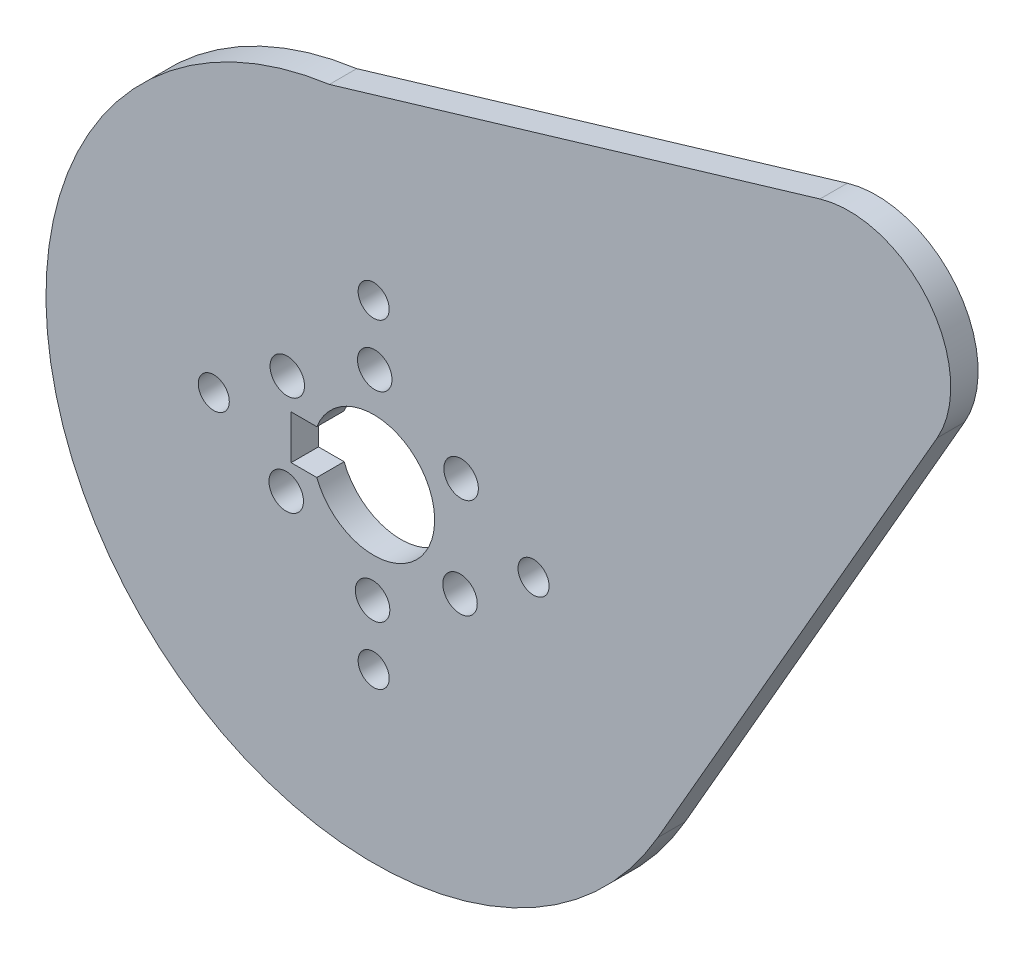
ISO-10303-21;
HEADER;
FILE_DESCRIPTION(('STEP AP214'),'2;1');
FILE_NAME('part.step','',(''),(''),'','','');
FILE_SCHEMA(('AUTOMOTIVE_DESIGN { 1 0 10303 214 1 1 1 1 }'));
ENDSEC;
DATA;
#1=APPLICATION_CONTEXT('core data for automotive mechanical design processes');
#2=APPLICATION_PROTOCOL_DEFINITION('international standard','automotive_design',2000,#1);
#3=PRODUCT_CONTEXT('',#1,'mechanical');
#4=PRODUCT('Part','Part','',(#3));
#5=PRODUCT_RELATED_PRODUCT_CATEGORY('part','',(#4));
#6=PRODUCT_DEFINITION_FORMATION('','',#4);
#7=PRODUCT_DEFINITION_CONTEXT('part definition',#1,'design');
#8=PRODUCT_DEFINITION('design','',#6,#7);
#9=PRODUCT_DEFINITION_SHAPE('','',#8);
#10=(LENGTH_UNIT() NAMED_UNIT(*) SI_UNIT(.MILLI.,.METRE.));
#11=(NAMED_UNIT(*) PLANE_ANGLE_UNIT() SI_UNIT($,.RADIAN.));
#12=(NAMED_UNIT(*) SI_UNIT($,.STERADIAN.) SOLID_ANGLE_UNIT());
#13=UNCERTAINTY_MEASURE_WITH_UNIT(LENGTH_MEASURE(1.E-05),#10,'distance_accuracy_value','');
#14=(GEOMETRIC_REPRESENTATION_CONTEXT(3) GLOBAL_UNCERTAINTY_ASSIGNED_CONTEXT((#13)) GLOBAL_UNIT_ASSIGNED_CONTEXT((#10,
#11,#12)) REPRESENTATION_CONTEXT('',''));
#15=CARTESIAN_POINT('',(0.,0.,0.));
#16=DIRECTION('',(0.,0.,1.));
#17=DIRECTION('',(1.,0.,0.));
#18=AXIS2_PLACEMENT_3D('',#15,#16,#17);
#19=CARTESIAN_POINT('',(0.,0.,3.17));
#20=DIRECTION('',(0.,0.,-1.));
#21=DIRECTION('',(-1.,0.,0.));
#22=AXIS2_PLACEMENT_3D('',#19,#20,#21);
#23=CYLINDRICAL_SURFACE('',#22,38.);
#24=CARTESIAN_POINT('',(0.,0.,0.));
#25=DIRECTION('',(0.,0.,1.));
#26=DIRECTION('',(1.,0.,0.));
#27=AXIS2_PLACEMENT_3D('',#24,#25,#26);
#28=CIRCLE('',#27,38.);
#29=CARTESIAN_POINT('',(-5.13430177986594,37.6515463856834,0.));
#30=VERTEX_POINT('',#29);
#31=CARTESIAN_POINT('',(32.94,-18.9461447265664,0.));
#32=VERTEX_POINT('',#31);
#33=EDGE_CURVE('E158',#30,#32,#28,.T.);
#34=ORIENTED_EDGE('',*,*,#33,.T.);
#35=DIRECTION('',(0.,0.,-1.));
#36=VECTOR('',#35,1.);
#37=CARTESIAN_POINT('',(32.94,-18.9461447265664,3.17));
#38=LINE('',#37,#36);
#39=CARTESIAN_POINT('',(32.94,-18.9461447265664,3.17));
#40=VERTEX_POINT('',#39);
#41=EDGE_CURVE('E11',#40,#32,#38,.T.);
#42=ORIENTED_EDGE('',*,*,#41,.F.);
#43=CARTESIAN_POINT('',(0.,0.,3.17));
#44=DIRECTION('',(0.,0.,1.));
#45=DIRECTION('',(1.,0.,0.));
#46=AXIS2_PLACEMENT_3D('',#43,#44,#45);
#47=CIRCLE('',#46,38.);
#48=CARTESIAN_POINT('',(-5.13430177986594,37.6515463856834,3.17));
#49=VERTEX_POINT('',#48);
#50=EDGE_CURVE('E143',#49,#40,#47,.T.);
#51=ORIENTED_EDGE('',*,*,#50,.F.);
#52=DIRECTION('',(0.,0.,-1.));
#53=VECTOR('',#52,1.);
#54=CARTESIAN_POINT('',(-5.13430177986594,37.6515463856834,3.17));
#55=LINE('',#54,#53);
#56=EDGE_CURVE('E156',#49,#30,#55,.T.);
#57=ORIENTED_EDGE('',*,*,#56,.T.);
#58=EDGE_LOOP('',(#34,#42,#51,#57));
#59=FACE_BOUND('',#58,.T.);
#60=ADVANCED_FACE('F43',(#59),#23,.T.);
#61=CARTESIAN_POINT('',(32.94,-18.9461447265664,3.17));
#62=DIRECTION('',(-0.866842105263158,0.498582755962273,0.));
#63=DIRECTION('',(-0.498582755962273,-0.866842105263158,0.));
#64=AXIS2_PLACEMENT_3D('',#61,#62,#63);
#65=PLANE('',#64);
#66=DIRECTION('',(0.498582755962274,0.866842105263158,0.));
#67=VECTOR('',#66,1.);
#68=CARTESIAN_POINT('',(32.94,-18.9461447265664,0.));
#69=LINE('',#68,#67);
#70=CARTESIAN_POINT('',(65.3478791375478,37.3985921155389,0.));
#71=VERTEX_POINT('',#70);
#72=EDGE_CURVE('E162',#32,#71,#69,.T.);
#73=ORIENTED_EDGE('',*,*,#72,.T.);
#74=DIRECTION('',(0.,0.,-1.));
#75=VECTOR('',#74,1.);
#76=CARTESIAN_POINT('',(65.3478791375478,37.3985921155389,3.17));
#77=LINE('',#76,#75);
#78=CARTESIAN_POINT('',(65.3478791375478,37.3985921155389,3.17));
#79=VERTEX_POINT('',#78);
#80=EDGE_CURVE('E51',#79,#71,#77,.T.);
#81=ORIENTED_EDGE('',*,*,#80,.F.);
#82=DIRECTION('',(0.498582755962274,0.866842105263158,0.));
#83=VECTOR('',#82,1.);
#84=CARTESIAN_POINT('',(32.94,-18.9461447265664,3.17));
#85=LINE('',#84,#83);
#86=EDGE_CURVE('E95',#40,#79,#85,.T.);
#87=ORIENTED_EDGE('',*,*,#86,.F.);
#88=ORIENTED_EDGE('',*,*,#41,.T.);
#89=EDGE_LOOP('',(#73,#81,#87,#88));
#90=FACE_BOUND('',#89,.T.);
#91=ADVANCED_FACE('F192',(#90),#65,.F.);
#92=CARTESIAN_POINT('',(55.1191422954425,43.2818686358937,3.17));
#93=DIRECTION('',(0.,0.,-1.));
#94=DIRECTION('',(-1.,0.,0.));
#95=AXIS2_PLACEMENT_3D('',#92,#93,#94);
#96=CYLINDRICAL_SURFACE('',#95,11.8);
#97=CARTESIAN_POINT('',(55.1191422954425,43.2818686358937,0.));
#98=DIRECTION('',(0.,0.,1.));
#99=DIRECTION('',(1.,0.,0.));
#100=AXIS2_PLACEMENT_3D('',#97,#98,#99);
#101=CIRCLE('',#100,11.8);
#102=CARTESIAN_POINT('',(51.7514574066594,54.591099312198,0.));
#103=VERTEX_POINT('',#102);
#104=EDGE_CURVE('E146',#71,#103,#101,.T.);
#105=ORIENTED_EDGE('',*,*,#104,.T.);
#106=DIRECTION('',(0.,0.,-1.));
#107=VECTOR('',#106,1.);
#108=CARTESIAN_POINT('',(51.7514574066594,54.591099312198,3.17));
#109=LINE('',#108,#107);
#110=CARTESIAN_POINT('',(51.7514574066594,54.591099312198,3.17));
#111=VERTEX_POINT('',#110);
#112=EDGE_CURVE('E166',#111,#103,#109,.T.);
#113=ORIENTED_EDGE('',*,*,#112,.F.);
#114=CARTESIAN_POINT('',(55.1191422954425,43.2818686358937,3.17));
#115=DIRECTION('',(0.,0.,1.));
#116=DIRECTION('',(1.,0.,0.));
#117=AXIS2_PLACEMENT_3D('',#114,#115,#116);
#118=CIRCLE('',#117,11.8);
#119=EDGE_CURVE('E153',#79,#111,#118,.T.);
#120=ORIENTED_EDGE('',*,*,#119,.F.);
#121=ORIENTED_EDGE('',*,*,#80,.T.);
#122=EDGE_LOOP('',(#105,#113,#120,#121));
#123=FACE_BOUND('',#122,.T.);
#124=ADVANCED_FACE('F171',(#123),#96,.T.);
#125=CARTESIAN_POINT('',(0.,0.,3.17));
#126=DIRECTION('',(0.,0.,-1.));
#127=DIRECTION('',(-1.,0.,0.));
#128=AXIS2_PLACEMENT_3D('',#125,#126,#127);
#129=CYLINDRICAL_SURFACE('',#128,7.07);
#130=DIRECTION('',(0.,0.,-1.));
#131=VECTOR('',#130,1.);
#132=CARTESIAN_POINT('',(-6.59411859159357,-2.55,3.171));
#133=LINE('',#132,#131);
#134=CARTESIAN_POINT('',(-6.59411859159357,-2.55,3.17));
#135=VERTEX_POINT('',#134);
#136=CARTESIAN_POINT('',(-6.59411859159357,-2.55,0.));
#137=VERTEX_POINT('',#136);
#138=EDGE_CURVE('E122',#135,#137,#133,.T.);
#139=ORIENTED_EDGE('',*,*,#138,.F.);
#140=CARTESIAN_POINT('',(0.,0.,3.17));
#141=DIRECTION('',(0.,0.,1.));
#142=DIRECTION('',(1.,0.,0.));
#143=AXIS2_PLACEMENT_3D('',#140,#141,#142);
#144=CIRCLE('',#143,7.07);
#145=CARTESIAN_POINT('',(-6.59411859159357,2.55,3.17));
#146=VERTEX_POINT('',#145);
#147=EDGE_CURVE('E134',#135,#146,#144,.T.);
#148=ORIENTED_EDGE('',*,*,#147,.T.);
#149=DIRECTION('',(0.,0.,-1.));
#150=VECTOR('',#149,1.);
#151=CARTESIAN_POINT('',(-6.59411859159357,2.55,3.171));
#152=LINE('',#151,#150);
#153=CARTESIAN_POINT('',(-6.59411859159357,2.55,0.));
#154=VERTEX_POINT('',#153);
#155=EDGE_CURVE('E137',#146,#154,#152,.T.);
#156=ORIENTED_EDGE('',*,*,#155,.T.);
#157=CARTESIAN_POINT('',(0.,0.,0.));
#158=DIRECTION('',(0.,0.,1.));
#159=DIRECTION('',(1.,0.,0.));
#160=AXIS2_PLACEMENT_3D('',#157,#158,#159);
#161=CIRCLE('',#160,7.07);
#162=EDGE_CURVE('E136',#137,#154,#161,.T.);
#163=ORIENTED_EDGE('',*,*,#162,.F.);
#164=EDGE_LOOP('',(#139,#148,#156,#163));
#165=FACE_BOUND('',#164,.T.);
#166=ADVANCED_FACE('F45',(#165),#129,.F.);
#167=CARTESIAN_POINT('',(-10.7169178814287,35.9891440151576,3.17));
#168=DIRECTION('',(0.285397024473149,-0.95840937934782,0.));
#169=DIRECTION('',(0.95840937934782,0.285397024473149,0.));
#170=AXIS2_PLACEMENT_3D('',#167,#168,#169);
#171=PLANE('',#170);
#172=DIRECTION('',(-0.95840937934782,-0.285397024473149,0.));
#173=VECTOR('',#172,1.);
#174=CARTESIAN_POINT('',(-10.7169178814287,35.9891440151576,0.));
#175=LINE('',#174,#173);
#176=EDGE_CURVE('E88',#103,#30,#175,.T.);
#177=ORIENTED_EDGE('',*,*,#176,.T.);
#178=ORIENTED_EDGE('',*,*,#56,.F.);
#179=DIRECTION('',(-0.95840937934782,-0.285397024473149,0.));
#180=VECTOR('',#179,1.);
#181=CARTESIAN_POINT('',(-10.7169178814287,35.9891440151576,3.17));
#182=LINE('',#181,#180);
#183=EDGE_CURVE('E67',#111,#49,#182,.T.);
#184=ORIENTED_EDGE('',*,*,#183,.F.);
#185=ORIENTED_EDGE('',*,*,#112,.T.);
#186=EDGE_LOOP('',(#177,#178,#184,#185));
#187=FACE_BOUND('',#186,.T.);
#188=ADVANCED_FACE('F179',(#187),#171,.F.);
#189=CARTESIAN_POINT('',(0.,0.,3.17));
#190=DIRECTION('',(0.,0.,1.));
#191=DIRECTION('',(1.,0.,0.));
#192=AXIS2_PLACEMENT_3D('',#189,#190,#191);
#193=PLANE('',#192);
#194=DIRECTION('',(-1.,0.,0.));
#195=VECTOR('',#194,1.);
#196=CARTESIAN_POINT('',(-6.59411859159357,-2.55,3.17));
#197=LINE('',#196,#195);
#198=CARTESIAN_POINT('',(-9.57,-2.55,3.17));
#199=VERTEX_POINT('',#198);
#200=EDGE_CURVE('E118',#135,#199,#197,.T.);
#201=ORIENTED_EDGE('',*,*,#200,.T.);
#202=DIRECTION('',(0.,1.,0.));
#203=VECTOR('',#202,1.);
#204=CARTESIAN_POINT('',(-9.57,2.55,3.17));
#205=LINE('',#204,#203);
#206=CARTESIAN_POINT('',(-9.57,2.55,3.17));
#207=VERTEX_POINT('',#206);
#208=EDGE_CURVE('E128',#199,#207,#205,.T.);
#209=ORIENTED_EDGE('',*,*,#208,.T.);
#210=DIRECTION('',(1.,0.,0.));
#211=VECTOR('',#210,1.);
#212=CARTESIAN_POINT('',(-6.59411859159357,2.55,3.17));
#213=LINE('',#212,#211);
#214=EDGE_CURVE('E142',#207,#146,#213,.T.);
#215=ORIENTED_EDGE('',*,*,#214,.T.);
#216=ORIENTED_EDGE('',*,*,#147,.F.);
#217=EDGE_LOOP('',(#201,#209,#215,#216));
#218=FACE_BOUND('',#217,.T.);
#219=CARTESIAN_POINT('',(-10.0150050556092,5.92649759437409,3.17));
#220=DIRECTION('',(0.,0.,1.));
#221=DIRECTION('',(1.,0.,0.));
#222=AXIS2_PLACEMENT_3D('',#219,#220,#221);
#223=CIRCLE('',#222,2.);
#224=CARTESIAN_POINT('',(-8.01500505560921,5.92649759437409,3.17));
#225=VERTEX_POINT('',#224);
#226=EDGE_CURVE('E348',#225,#225,#223,.T.);
#227=ORIENTED_EDGE('',*,*,#226,.F.);
#228=EDGE_LOOP('',(#227));
#229=FACE_BOUND('',#228,.T.);
#230=CARTESIAN_POINT('',(0.124994944390748,11.6364975943742,3.17));
#231=DIRECTION('',(0.,0.,1.));
#232=DIRECTION('',(1.,0.,0.));
#233=AXIS2_PLACEMENT_3D('',#230,#231,#232);
#234=CIRCLE('',#233,2.);
#235=CARTESIAN_POINT('',(2.12499494439075,11.6364975943742,3.17));
#236=VERTEX_POINT('',#235);
#237=EDGE_CURVE('E354',#236,#236,#234,.T.);
#238=ORIENTED_EDGE('',*,*,#237,.F.);
#239=EDGE_LOOP('',(#238));
#240=FACE_BOUND('',#239,.T.);
#241=CARTESIAN_POINT('',(10.14,5.71,3.17));
#242=DIRECTION('',(0.,0.,1.));
#243=DIRECTION('',(1.,0.,0.));
#244=AXIS2_PLACEMENT_3D('',#241,#242,#243);
#245=CIRCLE('',#244,2.);
#246=CARTESIAN_POINT('',(12.14,5.71,3.17));
#247=VERTEX_POINT('',#246);
#248=EDGE_CURVE('E360',#247,#247,#245,.T.);
#249=ORIENTED_EDGE('',*,*,#248,.F.);
#250=EDGE_LOOP('',(#249));
#251=FACE_BOUND('',#250,.T.);
#252=CARTESIAN_POINT('',(10.0150050556092,-5.92649759437416,3.17));
#253=DIRECTION('',(0.,0.,1.));
#254=DIRECTION('',(1.,0.,0.));
#255=AXIS2_PLACEMENT_3D('',#252,#253,#254);
#256=CIRCLE('',#255,2.);
#257=CARTESIAN_POINT('',(12.0150050556092,-5.92649759437416,3.17));
#258=VERTEX_POINT('',#257);
#259=EDGE_CURVE('E366',#258,#258,#256,.T.);
#260=ORIENTED_EDGE('',*,*,#259,.F.);
#261=EDGE_LOOP('',(#260));
#262=FACE_BOUND('',#261,.T.);
#263=CARTESIAN_POINT('',(-0.124994944390828,-11.6364975943742,3.17));
#264=DIRECTION('',(0.,0.,1.));
#265=DIRECTION('',(1.,0.,0.));
#266=AXIS2_PLACEMENT_3D('',#263,#264,#265);
#267=CIRCLE('',#266,2.);
#268=CARTESIAN_POINT('',(1.87500505560917,-11.6364975943742,3.17));
#269=VERTEX_POINT('',#268);
#270=EDGE_CURVE('E372',#269,#269,#267,.T.);
#271=ORIENTED_EDGE('',*,*,#270,.F.);
#272=EDGE_LOOP('',(#271));
#273=FACE_BOUND('',#272,.T.);
#274=CARTESIAN_POINT('',(-10.14,-5.71,3.17));
#275=DIRECTION('',(0.,0.,1.));
#276=DIRECTION('',(1.,0.,0.));
#277=AXIS2_PLACEMENT_3D('',#274,#275,#276);
#278=CIRCLE('',#277,2.);
#279=CARTESIAN_POINT('',(-8.14,-5.71,3.17));
#280=VERTEX_POINT('',#279);
#281=EDGE_CURVE('E378',#280,#280,#278,.T.);
#282=ORIENTED_EDGE('',*,*,#281,.F.);
#283=EDGE_LOOP('',(#282));
#284=FACE_BOUND('',#283,.T.);
#285=CARTESIAN_POINT('',(0.,-18.54,3.17));
#286=DIRECTION('',(0.,0.,1.));
#287=DIRECTION('',(0.,1.,0.));
#288=AXIS2_PLACEMENT_3D('',#285,#286,#287);
#289=CIRCLE('',#288,1.79981329706638);
#290=CARTESIAN_POINT('',(0.,-16.7401867029336,3.17));
#291=VERTEX_POINT('',#290);
#292=EDGE_CURVE('E388',#291,#291,#289,.T.);
#293=ORIENTED_EDGE('',*,*,#292,.F.);
#294=EDGE_LOOP('',(#293));
#295=FACE_BOUND('',#294,.T.);
#296=CARTESIAN_POINT('',(18.54,0.,3.17));
#297=DIRECTION('',(0.,0.,1.));
#298=DIRECTION('',(-1.,0.,0.));
#299=AXIS2_PLACEMENT_3D('',#296,#297,#298);
#300=CIRCLE('',#299,1.79981329706638);
#301=CARTESIAN_POINT('',(16.7401867029336,0.,3.17));
#302=VERTEX_POINT('',#301);
#303=EDGE_CURVE('E394',#302,#302,#300,.T.);
#304=ORIENTED_EDGE('',*,*,#303,.F.);
#305=EDGE_LOOP('',(#304));
#306=FACE_BOUND('',#305,.T.);
#307=CARTESIAN_POINT('',(-1.94196192066455E-13,18.54,3.17));
#308=DIRECTION('',(0.,0.,1.));
#309=DIRECTION('',(0.,-1.,0.));
#310=AXIS2_PLACEMENT_3D('',#307,#308,#309);
#311=CIRCLE('',#310,1.79981329706638);
#312=CARTESIAN_POINT('',(-1.75344148446128E-13,16.7401867029336,3.17));
#313=VERTEX_POINT('',#312);
#314=EDGE_CURVE('E384',#313,#313,#311,.T.);
#315=ORIENTED_EDGE('',*,*,#314,.F.);
#316=EDGE_LOOP('',(#315));
#317=FACE_BOUND('',#316,.T.);
#318=CARTESIAN_POINT('',(-18.54,0.,3.17));
#319=DIRECTION('',(0.,0.,1.));
#320=DIRECTION('',(1.,0.,0.));
#321=AXIS2_PLACEMENT_3D('',#318,#319,#320);
#322=CIRCLE('',#321,1.79981329706638);
#323=CARTESIAN_POINT('',(-16.7401867029336,0.,3.17));
#324=VERTEX_POINT('',#323);
#325=EDGE_CURVE('E149',#324,#324,#322,.T.);
#326=ORIENTED_EDGE('',*,*,#325,.F.);
#327=EDGE_LOOP('',(#326));
#328=FACE_BOUND('',#327,.T.);
#329=ORIENTED_EDGE('',*,*,#50,.T.);
#330=ORIENTED_EDGE('',*,*,#86,.T.);
#331=ORIENTED_EDGE('',*,*,#119,.T.);
#332=ORIENTED_EDGE('',*,*,#183,.T.);
#333=EDGE_LOOP('',(#329,#330,#331,#332));
#334=FACE_BOUND('',#333,.T.);
#335=ADVANCED_FACE('F140',(#218,#229,#240,#251,#262,#273,#284,#295,#306,#317,#328,#334),#193,.T.);
#336=CARTESIAN_POINT('',(0.,0.,0.));
#337=DIRECTION('',(0.,0.,1.));
#338=DIRECTION('',(1.,0.,0.));
#339=AXIS2_PLACEMENT_3D('',#336,#337,#338);
#340=PLANE('',#339);
#341=CARTESIAN_POINT('',(-10.0150050556092,5.92649759437409,0.));
#342=DIRECTION('',(0.,0.,1.));
#343=DIRECTION('',(1.,0.,0.));
#344=AXIS2_PLACEMENT_3D('',#341,#342,#343);
#345=CIRCLE('',#344,2.);
#346=CARTESIAN_POINT('',(-8.01500505560921,5.92649759437409,0.));
#347=VERTEX_POINT('',#346);
#348=EDGE_CURVE('E351',#347,#347,#345,.T.);
#349=ORIENTED_EDGE('',*,*,#348,.T.);
#350=EDGE_LOOP('',(#349));
#351=FACE_BOUND('',#350,.T.);
#352=CARTESIAN_POINT('',(0.124994944390748,11.6364975943742,0.));
#353=DIRECTION('',(0.,0.,1.));
#354=DIRECTION('',(1.,0.,0.));
#355=AXIS2_PLACEMENT_3D('',#352,#353,#354);
#356=CIRCLE('',#355,2.);
#357=CARTESIAN_POINT('',(2.12499494439075,11.6364975943742,0.));
#358=VERTEX_POINT('',#357);
#359=EDGE_CURVE('E357',#358,#358,#356,.T.);
#360=ORIENTED_EDGE('',*,*,#359,.T.);
#361=EDGE_LOOP('',(#360));
#362=FACE_BOUND('',#361,.T.);
#363=CARTESIAN_POINT('',(10.14,5.71,0.));
#364=DIRECTION('',(0.,0.,1.));
#365=DIRECTION('',(1.,0.,0.));
#366=AXIS2_PLACEMENT_3D('',#363,#364,#365);
#367=CIRCLE('',#366,2.);
#368=CARTESIAN_POINT('',(12.14,5.71,0.));
#369=VERTEX_POINT('',#368);
#370=EDGE_CURVE('E363',#369,#369,#367,.T.);
#371=ORIENTED_EDGE('',*,*,#370,.T.);
#372=EDGE_LOOP('',(#371));
#373=FACE_BOUND('',#372,.T.);
#374=CARTESIAN_POINT('',(10.0150050556092,-5.92649759437416,0.));
#375=DIRECTION('',(0.,0.,1.));
#376=DIRECTION('',(1.,0.,0.));
#377=AXIS2_PLACEMENT_3D('',#374,#375,#376);
#378=CIRCLE('',#377,2.);
#379=CARTESIAN_POINT('',(12.0150050556092,-5.92649759437416,0.));
#380=VERTEX_POINT('',#379);
#381=EDGE_CURVE('E369',#380,#380,#378,.T.);
#382=ORIENTED_EDGE('',*,*,#381,.T.);
#383=EDGE_LOOP('',(#382));
#384=FACE_BOUND('',#383,.T.);
#385=CARTESIAN_POINT('',(-0.124994944390828,-11.6364975943742,0.));
#386=DIRECTION('',(0.,0.,1.));
#387=DIRECTION('',(1.,0.,0.));
#388=AXIS2_PLACEMENT_3D('',#385,#386,#387);
#389=CIRCLE('',#388,2.);
#390=CARTESIAN_POINT('',(1.87500505560917,-11.6364975943742,0.));
#391=VERTEX_POINT('',#390);
#392=EDGE_CURVE('E375',#391,#391,#389,.T.);
#393=ORIENTED_EDGE('',*,*,#392,.T.);
#394=EDGE_LOOP('',(#393));
#395=FACE_BOUND('',#394,.T.);
#396=CARTESIAN_POINT('',(-10.14,-5.71,0.));
#397=DIRECTION('',(0.,0.,1.));
#398=DIRECTION('',(1.,0.,0.));
#399=AXIS2_PLACEMENT_3D('',#396,#397,#398);
#400=CIRCLE('',#399,2.);
#401=CARTESIAN_POINT('',(-8.14,-5.71,0.));
#402=VERTEX_POINT('',#401);
#403=EDGE_CURVE('E381',#402,#402,#400,.T.);
#404=ORIENTED_EDGE('',*,*,#403,.T.);
#405=EDGE_LOOP('',(#404));
#406=FACE_BOUND('',#405,.T.);
#407=CARTESIAN_POINT('',(0.,-18.54,0.));
#408=DIRECTION('',(0.,0.,1.));
#409=DIRECTION('',(0.,1.,0.));
#410=AXIS2_PLACEMENT_3D('',#407,#408,#409);
#411=CIRCLE('',#410,1.79981329706638);
#412=CARTESIAN_POINT('',(0.,-16.7401867029336,0.));
#413=VERTEX_POINT('',#412);
#414=EDGE_CURVE('E385',#413,#413,#411,.T.);
#415=ORIENTED_EDGE('',*,*,#414,.T.);
#416=EDGE_LOOP('',(#415));
#417=FACE_BOUND('',#416,.T.);
#418=CARTESIAN_POINT('',(18.54,0.,0.));
#419=DIRECTION('',(0.,0.,1.));
#420=DIRECTION('',(-1.,0.,0.));
#421=AXIS2_PLACEMENT_3D('',#418,#419,#420);
#422=CIRCLE('',#421,1.79981329706638);
#423=CARTESIAN_POINT('',(16.7401867029336,0.,0.));
#424=VERTEX_POINT('',#423);
#425=EDGE_CURVE('E391',#424,#424,#422,.T.);
#426=ORIENTED_EDGE('',*,*,#425,.T.);
#427=EDGE_LOOP('',(#426));
#428=FACE_BOUND('',#427,.T.);
#429=CARTESIAN_POINT('',(-1.94196192066455E-13,18.54,0.));
#430=DIRECTION('',(0.,0.,1.));
#431=DIRECTION('',(0.,-1.,0.));
#432=AXIS2_PLACEMENT_3D('',#429,#430,#431);
#433=CIRCLE('',#432,1.79981329706638);
#434=CARTESIAN_POINT('',(-1.75344148446128E-13,16.7401867029336,0.));
#435=VERTEX_POINT('',#434);
#436=EDGE_CURVE('E397',#435,#435,#433,.T.);
#437=ORIENTED_EDGE('',*,*,#436,.T.);
#438=EDGE_LOOP('',(#437));
#439=FACE_BOUND('',#438,.T.);
#440=CARTESIAN_POINT('',(-18.54,0.,0.));
#441=DIRECTION('',(0.,0.,1.));
#442=DIRECTION('',(1.,0.,0.));
#443=AXIS2_PLACEMENT_3D('',#440,#441,#442);
#444=CIRCLE('',#443,1.79981329706638);
#445=CARTESIAN_POINT('',(-16.7401867029336,0.,0.));
#446=VERTEX_POINT('',#445);
#447=EDGE_CURVE('E159',#446,#446,#444,.T.);
#448=ORIENTED_EDGE('',*,*,#447,.T.);
#449=EDGE_LOOP('',(#448));
#450=FACE_BOUND('',#449,.T.);
#451=DIRECTION('',(0.,1.,0.));
#452=VECTOR('',#451,1.);
#453=CARTESIAN_POINT('',(-9.57,2.55,0.));
#454=LINE('',#453,#452);
#455=CARTESIAN_POINT('',(-9.57,-2.55,0.));
#456=VERTEX_POINT('',#455);
#457=CARTESIAN_POINT('',(-9.57,2.55,0.));
#458=VERTEX_POINT('',#457);
#459=EDGE_CURVE('E58',#456,#458,#454,.T.);
#460=ORIENTED_EDGE('',*,*,#459,.F.);
#461=DIRECTION('',(-1.,0.,0.));
#462=VECTOR('',#461,1.);
#463=CARTESIAN_POINT('',(-6.59411859159357,-2.55,0.));
#464=LINE('',#463,#462);
#465=EDGE_CURVE('E338',#137,#456,#464,.T.);
#466=ORIENTED_EDGE('',*,*,#465,.F.);
#467=ORIENTED_EDGE('',*,*,#162,.T.);
#468=DIRECTION('',(1.,0.,0.));
#469=VECTOR('',#468,1.);
#470=CARTESIAN_POINT('',(-6.59411859159357,2.55,0.));
#471=LINE('',#470,#469);
#472=EDGE_CURVE('E337',#458,#154,#471,.T.);
#473=ORIENTED_EDGE('',*,*,#472,.F.);
#474=EDGE_LOOP('',(#460,#466,#467,#473));
#475=FACE_BOUND('',#474,.T.);
#476=ORIENTED_EDGE('',*,*,#33,.F.);
#477=ORIENTED_EDGE('',*,*,#176,.F.);
#478=ORIENTED_EDGE('',*,*,#104,.F.);
#479=ORIENTED_EDGE('',*,*,#72,.F.);
#480=EDGE_LOOP('',(#476,#477,#478,#479));
#481=FACE_BOUND('',#480,.T.);
#482=ADVANCED_FACE('F175',(#351,#362,#373,#384,#395,#406,#417,#428,#439,#450,#475,#481),#340,.F.);
#483=CARTESIAN_POINT('',(-18.54,0.,0.));
#484=DIRECTION('',(0.,0.,1.));
#485=DIRECTION('',(1.,0.,0.));
#486=AXIS2_PLACEMENT_3D('',#483,#484,#485);
#487=CYLINDRICAL_SURFACE('',#486,1.79981329706638);
#488=ORIENTED_EDGE('',*,*,#447,.F.);
#489=EDGE_LOOP('',(#488));
#490=FACE_BOUND('',#489,.T.);
#491=ORIENTED_EDGE('',*,*,#325,.T.);
#492=EDGE_LOOP('',(#491));
#493=FACE_BOUND('',#492,.T.);
#494=ADVANCED_FACE('F226',(#490,#493),#487,.F.);
#495=CARTESIAN_POINT('',(-1.94196192066455E-13,18.54,0.));
#496=DIRECTION('',(0.,0.,1.));
#497=DIRECTION('',(1.,0.,0.));
#498=AXIS2_PLACEMENT_3D('',#495,#496,#497);
#499=CYLINDRICAL_SURFACE('',#498,1.79981329706638);
#500=ORIENTED_EDGE('',*,*,#436,.F.);
#501=EDGE_LOOP('',(#500));
#502=FACE_BOUND('',#501,.T.);
#503=ORIENTED_EDGE('',*,*,#314,.T.);
#504=EDGE_LOOP('',(#503));
#505=FACE_BOUND('',#504,.T.);
#506=ADVANCED_FACE('F236',(#502,#505),#499,.F.);
#507=CARTESIAN_POINT('',(18.54,0.,0.));
#508=DIRECTION('',(0.,0.,1.));
#509=DIRECTION('',(1.,0.,0.));
#510=AXIS2_PLACEMENT_3D('',#507,#508,#509);
#511=CYLINDRICAL_SURFACE('',#510,1.79981329706638);
#512=ORIENTED_EDGE('',*,*,#425,.F.);
#513=EDGE_LOOP('',(#512));
#514=FACE_BOUND('',#513,.T.);
#515=ORIENTED_EDGE('',*,*,#303,.T.);
#516=EDGE_LOOP('',(#515));
#517=FACE_BOUND('',#516,.T.);
#518=ADVANCED_FACE('F244',(#514,#517),#511,.F.);
#519=CARTESIAN_POINT('',(0.,-18.54,0.));
#520=DIRECTION('',(0.,0.,1.));
#521=DIRECTION('',(1.,0.,0.));
#522=AXIS2_PLACEMENT_3D('',#519,#520,#521);
#523=CYLINDRICAL_SURFACE('',#522,1.79981329706638);
#524=ORIENTED_EDGE('',*,*,#414,.F.);
#525=EDGE_LOOP('',(#524));
#526=FACE_BOUND('',#525,.T.);
#527=ORIENTED_EDGE('',*,*,#292,.T.);
#528=EDGE_LOOP('',(#527));
#529=FACE_BOUND('',#528,.T.);
#530=ADVANCED_FACE('F252',(#526,#529),#523,.F.);
#531=CARTESIAN_POINT('',(-10.14,-5.71,3.17));
#532=DIRECTION('',(0.,0.,1.));
#533=DIRECTION('',(1.,0.,0.));
#534=AXIS2_PLACEMENT_3D('',#531,#532,#533);
#535=CYLINDRICAL_SURFACE('',#534,2.);
#536=ORIENTED_EDGE('',*,*,#403,.F.);
#537=EDGE_LOOP('',(#536));
#538=FACE_BOUND('',#537,.T.);
#539=ORIENTED_EDGE('',*,*,#281,.T.);
#540=EDGE_LOOP('',(#539));
#541=FACE_BOUND('',#540,.T.);
#542=ADVANCED_FACE('F260',(#538,#541),#535,.F.);
#543=CARTESIAN_POINT('',(-0.124994944390828,-11.6364975943742,3.17));
#544=DIRECTION('',(0.,0.,1.));
#545=DIRECTION('',(1.,0.,0.));
#546=AXIS2_PLACEMENT_3D('',#543,#544,#545);
#547=CYLINDRICAL_SURFACE('',#546,2.);
#548=ORIENTED_EDGE('',*,*,#392,.F.);
#549=EDGE_LOOP('',(#548));
#550=FACE_BOUND('',#549,.T.);
#551=ORIENTED_EDGE('',*,*,#270,.T.);
#552=EDGE_LOOP('',(#551));
#553=FACE_BOUND('',#552,.T.);
#554=ADVANCED_FACE('F268',(#550,#553),#547,.F.);
#555=CARTESIAN_POINT('',(10.0150050556092,-5.92649759437416,3.17));
#556=DIRECTION('',(0.,0.,1.));
#557=DIRECTION('',(1.,0.,0.));
#558=AXIS2_PLACEMENT_3D('',#555,#556,#557);
#559=CYLINDRICAL_SURFACE('',#558,2.);
#560=ORIENTED_EDGE('',*,*,#381,.F.);
#561=EDGE_LOOP('',(#560));
#562=FACE_BOUND('',#561,.T.);
#563=ORIENTED_EDGE('',*,*,#259,.T.);
#564=EDGE_LOOP('',(#563));
#565=FACE_BOUND('',#564,.T.);
#566=ADVANCED_FACE('F276',(#562,#565),#559,.F.);
#567=CARTESIAN_POINT('',(10.14,5.71,3.17));
#568=DIRECTION('',(0.,0.,1.));
#569=DIRECTION('',(1.,0.,0.));
#570=AXIS2_PLACEMENT_3D('',#567,#568,#569);
#571=CYLINDRICAL_SURFACE('',#570,2.);
#572=ORIENTED_EDGE('',*,*,#370,.F.);
#573=EDGE_LOOP('',(#572));
#574=FACE_BOUND('',#573,.T.);
#575=ORIENTED_EDGE('',*,*,#248,.T.);
#576=EDGE_LOOP('',(#575));
#577=FACE_BOUND('',#576,.T.);
#578=ADVANCED_FACE('F284',(#574,#577),#571,.F.);
#579=CARTESIAN_POINT('',(0.124994944390748,11.6364975943742,3.17));
#580=DIRECTION('',(0.,0.,1.));
#581=DIRECTION('',(1.,0.,0.));
#582=AXIS2_PLACEMENT_3D('',#579,#580,#581);
#583=CYLINDRICAL_SURFACE('',#582,2.);
#584=ORIENTED_EDGE('',*,*,#359,.F.);
#585=EDGE_LOOP('',(#584));
#586=FACE_BOUND('',#585,.T.);
#587=ORIENTED_EDGE('',*,*,#237,.T.);
#588=EDGE_LOOP('',(#587));
#589=FACE_BOUND('',#588,.T.);
#590=ADVANCED_FACE('F292',(#586,#589),#583,.F.);
#591=CARTESIAN_POINT('',(-10.0150050556092,5.92649759437409,3.17));
#592=DIRECTION('',(0.,0.,1.));
#593=DIRECTION('',(1.,0.,0.));
#594=AXIS2_PLACEMENT_3D('',#591,#592,#593);
#595=CYLINDRICAL_SURFACE('',#594,2.);
#596=ORIENTED_EDGE('',*,*,#348,.F.);
#597=EDGE_LOOP('',(#596));
#598=FACE_BOUND('',#597,.T.);
#599=ORIENTED_EDGE('',*,*,#226,.T.);
#600=EDGE_LOOP('',(#599));
#601=FACE_BOUND('',#600,.T.);
#602=ADVANCED_FACE('F300',(#598,#601),#595,.F.);
#603=CARTESIAN_POINT('',(-9.57,2.55,3.171));
#604=DIRECTION('',(-1.,0.,0.));
#605=DIRECTION('',(0.,0.,1.));
#606=AXIS2_PLACEMENT_3D('',#603,#604,#605);
#607=PLANE('',#606);
#608=DIRECTION('',(0.,0.,-1.));
#609=VECTOR('',#608,1.);
#610=CARTESIAN_POINT('',(-9.57,-2.55,3.171));
#611=LINE('',#610,#609);
#612=EDGE_CURVE('E124',#199,#456,#611,.T.);
#613=ORIENTED_EDGE('',*,*,#612,.T.);
#614=ORIENTED_EDGE('',*,*,#459,.T.);
#615=DIRECTION('',(0.,0.,-1.));
#616=VECTOR('',#615,1.);
#617=CARTESIAN_POINT('',(-9.57,2.55,3.171));
#618=LINE('',#617,#616);
#619=EDGE_CURVE('E335',#207,#458,#618,.T.);
#620=ORIENTED_EDGE('',*,*,#619,.F.);
#621=ORIENTED_EDGE('',*,*,#208,.F.);
#622=EDGE_LOOP('',(#613,#614,#620,#621));
#623=FACE_BOUND('',#622,.T.);
#624=ADVANCED_FACE('F307',(#623),#607,.F.);
#625=CARTESIAN_POINT('',(-6.59411859159357,-2.55,3.171));
#626=DIRECTION('',(0.,-1.,0.));
#627=DIRECTION('',(0.,0.,-1.));
#628=AXIS2_PLACEMENT_3D('',#625,#626,#627);
#629=PLANE('',#628);
#630=ORIENTED_EDGE('',*,*,#138,.T.);
#631=ORIENTED_EDGE('',*,*,#465,.T.);
#632=ORIENTED_EDGE('',*,*,#612,.F.);
#633=ORIENTED_EDGE('',*,*,#200,.F.);
#634=EDGE_LOOP('',(#630,#631,#632,#633));
#635=FACE_BOUND('',#634,.T.);
#636=ADVANCED_FACE('F120',(#635),#629,.F.);
#637=CARTESIAN_POINT('',(-6.59411859159357,2.55,3.171));
#638=DIRECTION('',(0.,1.,0.));
#639=DIRECTION('',(0.,0.,1.));
#640=AXIS2_PLACEMENT_3D('',#637,#638,#639);
#641=PLANE('',#640);
#642=ORIENTED_EDGE('',*,*,#619,.T.);
#643=ORIENTED_EDGE('',*,*,#472,.T.);
#644=ORIENTED_EDGE('',*,*,#155,.F.);
#645=ORIENTED_EDGE('',*,*,#214,.F.);
#646=EDGE_LOOP('',(#642,#643,#644,#645));
#647=FACE_BOUND('',#646,.T.);
#648=ADVANCED_FACE('F323',(#647),#641,.F.);
#649=CLOSED_SHELL('',(#60,#91,#124,#166,#188,#335,#482,#494,#506,#518,#530,#542,#554,#566,#578,
#590,#602,#624,#636,#648));
#650=MANIFOLD_SOLID_BREP('B2',#649);
#651=ADVANCED_BREP_SHAPE_REPRESENTATION('',(#18,#650),#14);
#652=SHAPE_DEFINITION_REPRESENTATION(#9,#651);
ENDSEC;
END-ISO-10303-21;
